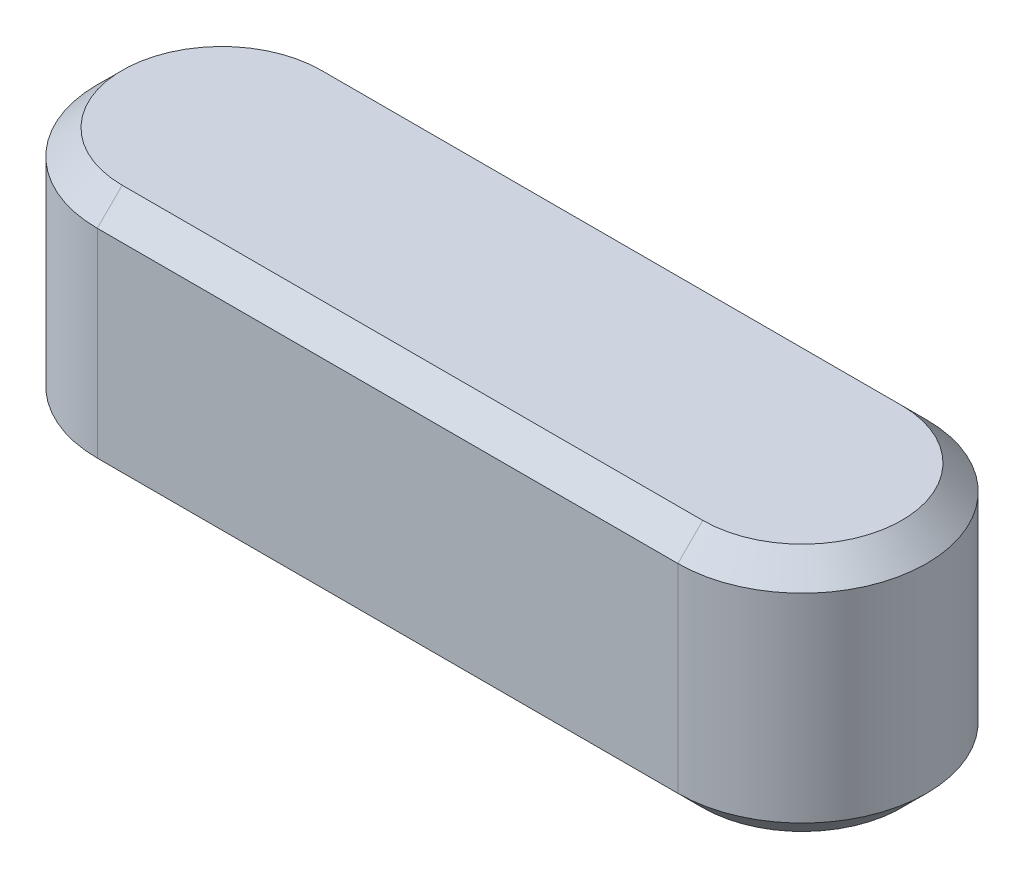
ISO-10303-21;
HEADER;
FILE_DESCRIPTION(('STEP AP214'),'2;1');
FILE_NAME('part.step','',(''),(''),'','','');
FILE_SCHEMA(('AUTOMOTIVE_DESIGN { 1 0 10303 214 1 1 1 1 }'));
ENDSEC;
DATA;
#1=APPLICATION_CONTEXT('core data for automotive mechanical design processes');
#2=APPLICATION_PROTOCOL_DEFINITION('international standard','automotive_design',2000,#1);
#3=PRODUCT_CONTEXT('',#1,'mechanical');
#4=PRODUCT('Part','Part','',(#3));
#5=PRODUCT_RELATED_PRODUCT_CATEGORY('part','',(#4));
#6=PRODUCT_DEFINITION_FORMATION('','',#4);
#7=PRODUCT_DEFINITION_CONTEXT('part definition',#1,'design');
#8=PRODUCT_DEFINITION('design','',#6,#7);
#9=PRODUCT_DEFINITION_SHAPE('','',#8);
#10=(LENGTH_UNIT() NAMED_UNIT(*) SI_UNIT(.MILLI.,.METRE.));
#11=(NAMED_UNIT(*) PLANE_ANGLE_UNIT() SI_UNIT($,.RADIAN.));
#12=(NAMED_UNIT(*) SI_UNIT($,.STERADIAN.) SOLID_ANGLE_UNIT());
#13=UNCERTAINTY_MEASURE_WITH_UNIT(LENGTH_MEASURE(1.E-05),#10,'distance_accuracy_value','');
#14=(GEOMETRIC_REPRESENTATION_CONTEXT(3) GLOBAL_UNCERTAINTY_ASSIGNED_CONTEXT((#13)) GLOBAL_UNIT_ASSIGNED_CONTEXT((#10,
#11,#12)) REPRESENTATION_CONTEXT('',''));
#15=CARTESIAN_POINT('',(0.,0.,0.));
#16=DIRECTION('',(0.,0.,1.));
#17=DIRECTION('',(1.,0.,0.));
#18=AXIS2_PLACEMENT_3D('',#15,#16,#17);
#19=CARTESIAN_POINT('',(-3.5,3.,0.));
#20=DIRECTION('',(0.,-1.,0.));
#21=DIRECTION('',(0.,0.,-1.));
#22=AXIS2_PLACEMENT_3D('',#19,#20,#21);
#23=CYLINDRICAL_SURFACE('',#22,1.5);
#24=DIRECTION('',(0.,-1.,0.));
#25=VECTOR('',#24,1.);
#26=CARTESIAN_POINT('',(-3.5,3.,1.5));
#27=LINE('',#26,#25);
#28=CARTESIAN_POINT('',(-3.5,2.7,1.5));
#29=VERTEX_POINT('',#28);
#30=CARTESIAN_POINT('',(-3.5,0.299999999999999,1.5));
#31=VERTEX_POINT('',#30);
#32=EDGE_CURVE('E126',#29,#31,#27,.T.);
#33=ORIENTED_EDGE('',*,*,#32,.F.);
#34=CARTESIAN_POINT('',(-3.5,2.7,0.));
#35=DIRECTION('',(0.,1.,0.));
#36=DIRECTION('',(0.,0.,1.));
#37=AXIS2_PLACEMENT_3D('',#34,#35,#36);
#38=CIRCLE('',#37,1.5);
#39=CARTESIAN_POINT('',(-3.5,2.7,-1.5));
#40=VERTEX_POINT('',#39);
#41=EDGE_CURVE('E129',#29,#40,#38,.F.);
#42=ORIENTED_EDGE('',*,*,#41,.T.);
#43=DIRECTION('',(0.,-1.,0.));
#44=VECTOR('',#43,1.);
#45=CARTESIAN_POINT('',(-3.5,3.,-1.5));
#46=LINE('',#45,#44);
#47=CARTESIAN_POINT('',(-3.5,0.299999999999999,-1.5));
#48=VERTEX_POINT('',#47);
#49=EDGE_CURVE('E132',#40,#48,#46,.T.);
#50=ORIENTED_EDGE('',*,*,#49,.T.);
#51=CARTESIAN_POINT('',(-3.5,0.299999999999999,0.));
#52=DIRECTION('',(0.,1.,0.));
#53=DIRECTION('',(0.,0.,1.));
#54=AXIS2_PLACEMENT_3D('',#51,#52,#53);
#55=CIRCLE('',#54,1.5);
#56=EDGE_CURVE('E166',#48,#31,#55,.T.);
#57=ORIENTED_EDGE('',*,*,#56,.T.);
#58=EDGE_LOOP('',(#33,#42,#50,#57));
#59=FACE_BOUND('',#58,.T.);
#60=ADVANCED_FACE('F37',(#59),#23,.T.);
#61=CARTESIAN_POINT('',(-3.5,3.,1.5));
#62=DIRECTION('',(0.,0.,-1.));
#63=DIRECTION('',(-1.,0.,0.));
#64=AXIS2_PLACEMENT_3D('',#61,#62,#63);
#65=PLANE('',#64);
#66=DIRECTION('',(0.,-1.,0.));
#67=VECTOR('',#66,1.);
#68=CARTESIAN_POINT('',(3.5,3.,1.5));
#69=LINE('',#68,#67);
#70=CARTESIAN_POINT('',(3.5,2.7,1.5));
#71=VERTEX_POINT('',#70);
#72=CARTESIAN_POINT('',(3.5,0.299999999999999,1.5));
#73=VERTEX_POINT('',#72);
#74=EDGE_CURVE('E178',#71,#73,#69,.T.);
#75=ORIENTED_EDGE('',*,*,#74,.F.);
#76=DIRECTION('',(-1.,0.,0.));
#77=VECTOR('',#76,1.);
#78=CARTESIAN_POINT('',(-3.5,2.7,1.5));
#79=LINE('',#78,#77);
#80=EDGE_CURVE('E157',#71,#29,#79,.T.);
#81=ORIENTED_EDGE('',*,*,#80,.T.);
#82=ORIENTED_EDGE('',*,*,#32,.T.);
#83=DIRECTION('',(1.,0.,0.));
#84=VECTOR('',#83,1.);
#85=CARTESIAN_POINT('',(-3.5,0.299999999999999,1.5));
#86=LINE('',#85,#84);
#87=EDGE_CURVE('E159',#31,#73,#86,.T.);
#88=ORIENTED_EDGE('',*,*,#87,.T.);
#89=EDGE_LOOP('',(#75,#81,#82,#88));
#90=FACE_BOUND('',#89,.T.);
#91=ADVANCED_FACE('F200',(#90),#65,.F.);
#92=CARTESIAN_POINT('',(3.5,3.,0.));
#93=DIRECTION('',(0.,-1.,0.));
#94=DIRECTION('',(0.,0.,-1.));
#95=AXIS2_PLACEMENT_3D('',#92,#93,#94);
#96=CYLINDRICAL_SURFACE('',#95,1.5);
#97=DIRECTION('',(0.,-1.,0.));
#98=VECTOR('',#97,1.);
#99=CARTESIAN_POINT('',(3.5,3.,-1.5));
#100=LINE('',#99,#98);
#101=CARTESIAN_POINT('',(3.5,2.7,-1.5));
#102=VERTEX_POINT('',#101);
#103=CARTESIAN_POINT('',(3.5,0.299999999999999,-1.5));
#104=VERTEX_POINT('',#103);
#105=EDGE_CURVE('E181',#102,#104,#100,.T.);
#106=ORIENTED_EDGE('',*,*,#105,.F.);
#107=CARTESIAN_POINT('',(3.5,2.7,0.));
#108=DIRECTION('',(0.,1.,0.));
#109=DIRECTION('',(0.,0.,1.));
#110=AXIS2_PLACEMENT_3D('',#107,#108,#109);
#111=CIRCLE('',#110,1.5);
#112=EDGE_CURVE('E161',#102,#71,#111,.F.);
#113=ORIENTED_EDGE('',*,*,#112,.T.);
#114=ORIENTED_EDGE('',*,*,#74,.T.);
#115=CARTESIAN_POINT('',(3.5,0.299999999999999,0.));
#116=DIRECTION('',(0.,1.,0.));
#117=DIRECTION('',(0.,0.,1.));
#118=AXIS2_PLACEMENT_3D('',#115,#116,#117);
#119=CIRCLE('',#118,1.5);
#120=EDGE_CURVE('E163',#73,#104,#119,.T.);
#121=ORIENTED_EDGE('',*,*,#120,.T.);
#122=EDGE_LOOP('',(#106,#113,#114,#121));
#123=FACE_BOUND('',#122,.T.);
#124=ADVANCED_FACE('F198',(#123),#96,.T.);
#125=CARTESIAN_POINT('',(-3.5,3.,-1.5));
#126=DIRECTION('',(0.,0.,1.));
#127=DIRECTION('',(1.,0.,0.));
#128=AXIS2_PLACEMENT_3D('',#125,#126,#127);
#129=PLANE('',#128);
#130=ORIENTED_EDGE('',*,*,#49,.F.);
#131=DIRECTION('',(1.,0.,0.));
#132=VECTOR('',#131,1.);
#133=CARTESIAN_POINT('',(3.5,2.7,-1.5));
#134=LINE('',#133,#132);
#135=EDGE_CURVE('E168',#40,#102,#134,.T.);
#136=ORIENTED_EDGE('',*,*,#135,.T.);
#137=ORIENTED_EDGE('',*,*,#105,.T.);
#138=DIRECTION('',(-1.,0.,0.));
#139=VECTOR('',#138,1.);
#140=CARTESIAN_POINT('',(-3.5,0.299999999999999,-1.5));
#141=LINE('',#140,#139);
#142=EDGE_CURVE('E171',#104,#48,#141,.T.);
#143=ORIENTED_EDGE('',*,*,#142,.T.);
#144=EDGE_LOOP('',(#130,#136,#137,#143));
#145=FACE_BOUND('',#144,.T.);
#146=ADVANCED_FACE('F189',(#145),#129,.F.);
#147=CARTESIAN_POINT('',(-3.5,3.,0.));
#148=DIRECTION('',(0.,1.,0.));
#149=DIRECTION('',(0.,0.,1.));
#150=AXIS2_PLACEMENT_3D('',#147,#148,#149);
#151=PLANE('',#150);
#152=CARTESIAN_POINT('',(3.5,3.,0.));
#153=DIRECTION('',(0.,1.,0.));
#154=DIRECTION('',(0.,0.,1.));
#155=AXIS2_PLACEMENT_3D('',#152,#153,#154);
#156=CIRCLE('',#155,1.2);
#157=CARTESIAN_POINT('',(3.5,3.,1.2));
#158=VERTEX_POINT('',#157);
#159=CARTESIAN_POINT('',(3.5,3.,-1.2));
#160=VERTEX_POINT('',#159);
#161=EDGE_CURVE('E115',#158,#160,#156,.T.);
#162=ORIENTED_EDGE('',*,*,#161,.T.);
#163=DIRECTION('',(-1.,0.,0.));
#164=VECTOR('',#163,1.);
#165=CARTESIAN_POINT('',(-3.5,3.,-1.2));
#166=LINE('',#165,#164);
#167=CARTESIAN_POINT('',(-3.5,3.,-1.2));
#168=VERTEX_POINT('',#167);
#169=EDGE_CURVE('E111',#160,#168,#166,.T.);
#170=ORIENTED_EDGE('',*,*,#169,.T.);
#171=CARTESIAN_POINT('',(-3.5,3.,0.));
#172=DIRECTION('',(0.,1.,0.));
#173=DIRECTION('',(0.,0.,1.));
#174=AXIS2_PLACEMENT_3D('',#171,#172,#173);
#175=CIRCLE('',#174,1.2);
#176=CARTESIAN_POINT('',(-3.5,3.,1.2));
#177=VERTEX_POINT('',#176);
#178=EDGE_CURVE('E105',#168,#177,#175,.T.);
#179=ORIENTED_EDGE('',*,*,#178,.T.);
#180=DIRECTION('',(1.,0.,0.));
#181=VECTOR('',#180,1.);
#182=CARTESIAN_POINT('',(3.5,3.,1.2));
#183=LINE('',#182,#181);
#184=EDGE_CURVE('E108',#177,#158,#183,.T.);
#185=ORIENTED_EDGE('',*,*,#184,.T.);
#186=EDGE_LOOP('',(#162,#170,#179,#185));
#187=FACE_BOUND('',#186,.T.);
#188=ADVANCED_FACE('F107',(#187),#151,.T.);
#189=CARTESIAN_POINT('',(-3.5,0.,0.));
#190=DIRECTION('',(0.,1.,0.));
#191=DIRECTION('',(0.,0.,1.));
#192=AXIS2_PLACEMENT_3D('',#189,#190,#191);
#193=PLANE('',#192);
#194=CARTESIAN_POINT('',(-3.5,0.,0.));
#195=DIRECTION('',(0.,1.,0.));
#196=DIRECTION('',(0.,0.,1.));
#197=AXIS2_PLACEMENT_3D('',#194,#195,#196);
#198=CIRCLE('',#197,1.2);
#199=CARTESIAN_POINT('',(-3.5,0.,1.2));
#200=VERTEX_POINT('',#199);
#201=CARTESIAN_POINT('',(-3.5,0.,-1.2));
#202=VERTEX_POINT('',#201);
#203=EDGE_CURVE('E47',#200,#202,#198,.F.);
#204=ORIENTED_EDGE('',*,*,#203,.T.);
#205=DIRECTION('',(1.,0.,0.));
#206=VECTOR('',#205,1.);
#207=CARTESIAN_POINT('',(-3.5,0.,-1.2));
#208=LINE('',#207,#206);
#209=CARTESIAN_POINT('',(3.5,0.,-1.2));
#210=VERTEX_POINT('',#209);
#211=EDGE_CURVE('E11',#202,#210,#208,.T.);
#212=ORIENTED_EDGE('',*,*,#211,.T.);
#213=CARTESIAN_POINT('',(3.5,0.,0.));
#214=DIRECTION('',(0.,1.,0.));
#215=DIRECTION('',(0.,0.,1.));
#216=AXIS2_PLACEMENT_3D('',#213,#214,#215);
#217=CIRCLE('',#216,1.2);
#218=CARTESIAN_POINT('',(3.5,0.,1.2));
#219=VERTEX_POINT('',#218);
#220=EDGE_CURVE('E153',#210,#219,#217,.F.);
#221=ORIENTED_EDGE('',*,*,#220,.T.);
#222=DIRECTION('',(-1.,0.,0.));
#223=VECTOR('',#222,1.);
#224=CARTESIAN_POINT('',(-3.5,0.,1.2));
#225=LINE('',#224,#223);
#226=EDGE_CURVE('E155',#219,#200,#225,.T.);
#227=ORIENTED_EDGE('',*,*,#226,.T.);
#228=EDGE_LOOP('',(#204,#212,#221,#227));
#229=FACE_BOUND('',#228,.T.);
#230=ADVANCED_FACE('F243',(#229),#193,.F.);
#231=CARTESIAN_POINT('',(-3.5,3.,1.2));
#232=DIRECTION('',(0.,0.707106781186547,0.707106781186549));
#233=DIRECTION('',(-1.,0.,0.));
#234=AXIS2_PLACEMENT_3D('',#231,#232,#233);
#235=PLANE('',#234);
#236=DIRECTION('',(0.,0.707106781186549,-0.707106781186547));
#237=VECTOR('',#236,1.);
#238=CARTESIAN_POINT('',(-3.5,2.7,1.5));
#239=LINE('',#238,#237);
#240=EDGE_CURVE('E121',#29,#177,#239,.T.);
#241=ORIENTED_EDGE('',*,*,#240,.F.);
#242=ORIENTED_EDGE('',*,*,#80,.F.);
#243=DIRECTION('',(0.,-0.707106781186549,0.707106781186547));
#244=VECTOR('',#243,1.);
#245=CARTESIAN_POINT('',(3.5,3.,1.2));
#246=LINE('',#245,#244);
#247=EDGE_CURVE('E124',#158,#71,#246,.T.);
#248=ORIENTED_EDGE('',*,*,#247,.F.);
#249=ORIENTED_EDGE('',*,*,#184,.F.);
#250=EDGE_LOOP('',(#241,#242,#248,#249));
#251=FACE_BOUND('',#250,.T.);
#252=ADVANCED_FACE('F119',(#251),#235,.T.);
#253=CARTESIAN_POINT('',(3.5,3.,0.));
#254=DIRECTION('',(0.,-1.,0.));
#255=DIRECTION('',(0.,0.,-1.));
#256=AXIS2_PLACEMENT_3D('',#253,#254,#255);
#257=CONICAL_SURFACE('',#256,1.2,0.785398163397447);
#258=ORIENTED_EDGE('',*,*,#247,.T.);
#259=ORIENTED_EDGE('',*,*,#112,.F.);
#260=DIRECTION('',(0.,-0.707106781186549,-0.707106781186547));
#261=VECTOR('',#260,1.);
#262=CARTESIAN_POINT('',(3.5,3.,-1.2));
#263=LINE('',#262,#261);
#264=EDGE_CURVE('E130',#160,#102,#263,.T.);
#265=ORIENTED_EDGE('',*,*,#264,.F.);
#266=ORIENTED_EDGE('',*,*,#161,.F.);
#267=EDGE_LOOP('',(#258,#259,#265,#266));
#268=FACE_BOUND('',#267,.T.);
#269=ADVANCED_FACE('F195',(#268),#257,.T.);
#270=CARTESIAN_POINT('',(-3.5,3.,0.));
#271=DIRECTION('',(0.,-1.,0.));
#272=DIRECTION('',(0.,0.,-1.));
#273=AXIS2_PLACEMENT_3D('',#270,#271,#272);
#274=CONICAL_SURFACE('',#273,1.2,0.785398163397447);
#275=ORIENTED_EDGE('',*,*,#240,.T.);
#276=ORIENTED_EDGE('',*,*,#178,.F.);
#277=DIRECTION('',(0.,0.707106781186549,0.707106781186547));
#278=VECTOR('',#277,1.);
#279=CARTESIAN_POINT('',(-3.5,2.7,-1.5));
#280=LINE('',#279,#278);
#281=EDGE_CURVE('E134',#40,#168,#280,.T.);
#282=ORIENTED_EDGE('',*,*,#281,.F.);
#283=ORIENTED_EDGE('',*,*,#41,.F.);
#284=EDGE_LOOP('',(#275,#276,#282,#283));
#285=FACE_BOUND('',#284,.T.);
#286=ADVANCED_FACE('F128',(#285),#274,.T.);
#287=CARTESIAN_POINT('',(-3.5,3.,-1.2));
#288=DIRECTION('',(0.,0.707106781186547,-0.707106781186549));
#289=DIRECTION('',(1.,0.,0.));
#290=AXIS2_PLACEMENT_3D('',#287,#288,#289);
#291=PLANE('',#290);
#292=ORIENTED_EDGE('',*,*,#264,.T.);
#293=ORIENTED_EDGE('',*,*,#135,.F.);
#294=ORIENTED_EDGE('',*,*,#281,.T.);
#295=ORIENTED_EDGE('',*,*,#169,.F.);
#296=EDGE_LOOP('',(#292,#293,#294,#295));
#297=FACE_BOUND('',#296,.T.);
#298=ADVANCED_FACE('F191',(#297),#291,.T.);
#299=CARTESIAN_POINT('',(-3.5,0.299999999999999,1.5));
#300=DIRECTION('',(0.,0.70710678118655,-0.707106781186545));
#301=DIRECTION('',(1.,0.,0.));
#302=AXIS2_PLACEMENT_3D('',#299,#300,#301);
#303=PLANE('',#302);
#304=DIRECTION('',(0.,0.707106781186545,0.70710678118655));
#305=VECTOR('',#304,1.);
#306=CARTESIAN_POINT('',(-3.5,0.,1.2));
#307=LINE('',#306,#305);
#308=EDGE_CURVE('E140',#200,#31,#307,.T.);
#309=ORIENTED_EDGE('',*,*,#308,.F.);
#310=ORIENTED_EDGE('',*,*,#226,.F.);
#311=DIRECTION('',(0.,-0.707106781186545,-0.70710678118655));
#312=VECTOR('',#311,1.);
#313=CARTESIAN_POINT('',(3.5,0.299999999999999,1.5));
#314=LINE('',#313,#312);
#315=EDGE_CURVE('E42',#73,#219,#314,.T.);
#316=ORIENTED_EDGE('',*,*,#315,.F.);
#317=ORIENTED_EDGE('',*,*,#87,.F.);
#318=EDGE_LOOP('',(#309,#310,#316,#317));
#319=FACE_BOUND('',#318,.T.);
#320=ADVANCED_FACE('F40',(#319),#303,.F.);
#321=CARTESIAN_POINT('',(3.5,0.299999999999999,0.));
#322=DIRECTION('',(0.,1.,0.));
#323=DIRECTION('',(0.,0.,1.));
#324=AXIS2_PLACEMENT_3D('',#321,#322,#323);
#325=CONICAL_SURFACE('',#324,1.5,0.785398163397451);
#326=ORIENTED_EDGE('',*,*,#315,.T.);
#327=ORIENTED_EDGE('',*,*,#220,.F.);
#328=DIRECTION('',(0.,-0.707106781186545,0.70710678118655));
#329=VECTOR('',#328,1.);
#330=CARTESIAN_POINT('',(3.5,0.299999999999999,-1.5));
#331=LINE('',#330,#329);
#332=EDGE_CURVE('E60',#104,#210,#331,.T.);
#333=ORIENTED_EDGE('',*,*,#332,.F.);
#334=ORIENTED_EDGE('',*,*,#120,.F.);
#335=EDGE_LOOP('',(#326,#327,#333,#334));
#336=FACE_BOUND('',#335,.T.);
#337=ADVANCED_FACE('F204',(#336),#325,.T.);
#338=CARTESIAN_POINT('',(-3.5,0.299999999999999,0.));
#339=DIRECTION('',(0.,1.,0.));
#340=DIRECTION('',(0.,0.,1.));
#341=AXIS2_PLACEMENT_3D('',#338,#339,#340);
#342=CONICAL_SURFACE('',#341,1.5,0.785398163397451);
#343=ORIENTED_EDGE('',*,*,#308,.T.);
#344=ORIENTED_EDGE('',*,*,#56,.F.);
#345=DIRECTION('',(0.,0.707106781186545,-0.70710678118655));
#346=VECTOR('',#345,1.);
#347=CARTESIAN_POINT('',(-3.5,0.,-1.2));
#348=LINE('',#347,#346);
#349=EDGE_CURVE('E138',#202,#48,#348,.T.);
#350=ORIENTED_EDGE('',*,*,#349,.F.);
#351=ORIENTED_EDGE('',*,*,#203,.F.);
#352=EDGE_LOOP('',(#343,#344,#350,#351));
#353=FACE_BOUND('',#352,.T.);
#354=ADVANCED_FACE('F207',(#353),#342,.T.);
#355=CARTESIAN_POINT('',(-3.5,0.299999999999999,-1.5));
#356=DIRECTION('',(0.,0.70710678118655,0.707106781186545));
#357=DIRECTION('',(-1.,0.,0.));
#358=AXIS2_PLACEMENT_3D('',#355,#356,#357);
#359=PLANE('',#358);
#360=ORIENTED_EDGE('',*,*,#332,.T.);
#361=ORIENTED_EDGE('',*,*,#211,.F.);
#362=ORIENTED_EDGE('',*,*,#349,.T.);
#363=ORIENTED_EDGE('',*,*,#142,.F.);
#364=EDGE_LOOP('',(#360,#361,#362,#363));
#365=FACE_BOUND('',#364,.T.);
#366=ADVANCED_FACE('F205',(#365),#359,.F.);
#367=CLOSED_SHELL('',(#60,#91,#124,#146,#188,#230,#252,#269,#286,#298,#320,#337,#354,#366));
#368=MANIFOLD_SOLID_BREP('B2',#367);
#369=ADVANCED_BREP_SHAPE_REPRESENTATION('',(#18,#368),#14);
#370=SHAPE_DEFINITION_REPRESENTATION(#9,#369);
ENDSEC;
END-ISO-10303-21;
